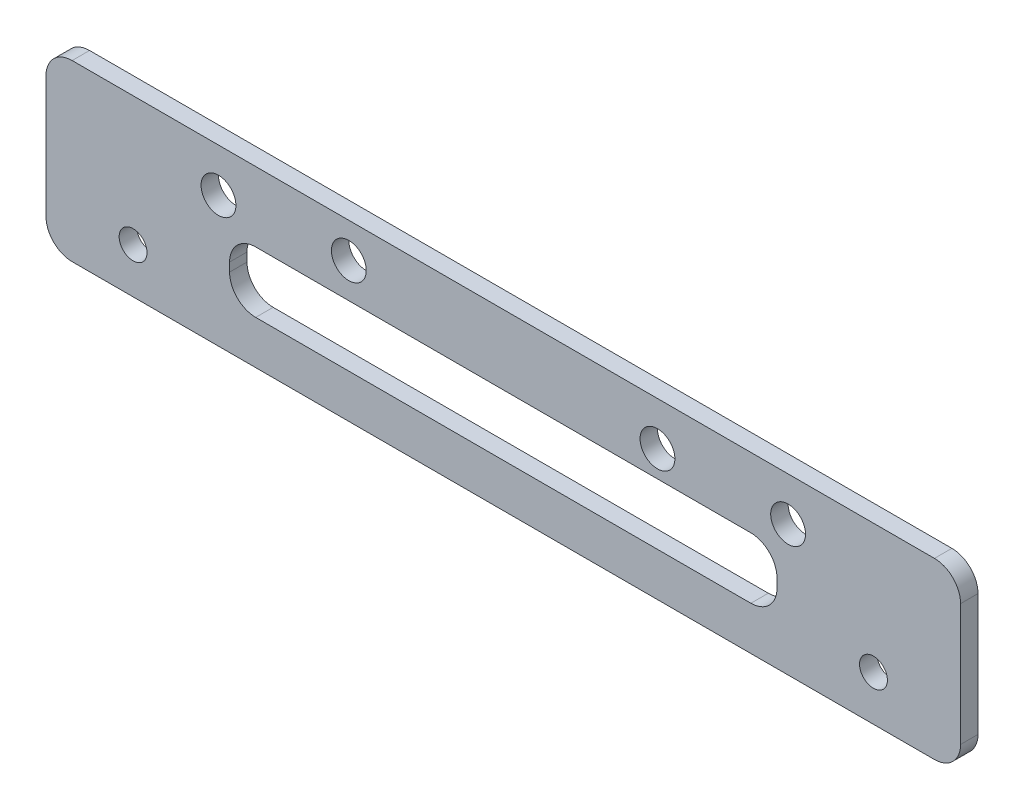
ISO-10303-21;
HEADER;
FILE_DESCRIPTION(('STEP AP214'),'2;1');
FILE_NAME('part.step','',(''),(''),'','','');
FILE_SCHEMA(('AUTOMOTIVE_DESIGN { 1 0 10303 214 1 1 1 1 }'));
ENDSEC;
DATA;
#1=APPLICATION_CONTEXT('core data for automotive mechanical design processes');
#2=APPLICATION_PROTOCOL_DEFINITION('international standard','automotive_design',2000,#1);
#3=PRODUCT_CONTEXT('',#1,'mechanical');
#4=PRODUCT('Part','Part','',(#3));
#5=PRODUCT_RELATED_PRODUCT_CATEGORY('part','',(#4));
#6=PRODUCT_DEFINITION_FORMATION('','',#4);
#7=PRODUCT_DEFINITION_CONTEXT('part definition',#1,'design');
#8=PRODUCT_DEFINITION('design','',#6,#7);
#9=PRODUCT_DEFINITION_SHAPE('','',#8);
#10=(LENGTH_UNIT() NAMED_UNIT(*) SI_UNIT(.MILLI.,.METRE.));
#11=(NAMED_UNIT(*) PLANE_ANGLE_UNIT() SI_UNIT($,.RADIAN.));
#12=(NAMED_UNIT(*) SI_UNIT($,.STERADIAN.) SOLID_ANGLE_UNIT());
#13=UNCERTAINTY_MEASURE_WITH_UNIT(LENGTH_MEASURE(1.E-05),#10,'distance_accuracy_value','');
#14=(GEOMETRIC_REPRESENTATION_CONTEXT(3) GLOBAL_UNCERTAINTY_ASSIGNED_CONTEXT((#13)) GLOBAL_UNIT_ASSIGNED_CONTEXT((#10,
#11,#12)) REPRESENTATION_CONTEXT('',''));
#15=CARTESIAN_POINT('',(0.,0.,0.));
#16=DIRECTION('',(0.,0.,1.));
#17=DIRECTION('',(1.,0.,0.));
#18=AXIS2_PLACEMENT_3D('',#15,#16,#17);
#19=CARTESIAN_POINT('',(52.5,10.,2.));
#20=DIRECTION('',(-1.,0.,0.));
#21=DIRECTION('',(0.,0.,1.));
#22=AXIS2_PLACEMENT_3D('',#19,#20,#21);
#23=PLANE('',#22);
#24=DIRECTION('',(0.,1.,0.));
#25=VECTOR('',#24,1.);
#26=CARTESIAN_POINT('',(52.5,10.,2.));
#27=LINE('',#26,#25);
#28=CARTESIAN_POINT('',(52.5,-7.,2.));
#29=VERTEX_POINT('',#28);
#30=CARTESIAN_POINT('',(52.5,7.,2.));
#31=VERTEX_POINT('',#30);
#32=EDGE_CURVE('E201',#29,#31,#27,.T.);
#33=ORIENTED_EDGE('',*,*,#32,.F.);
#34=DIRECTION('',(0.,0.,-1.));
#35=VECTOR('',#34,1.);
#36=CARTESIAN_POINT('',(52.5,-7.,2.));
#37=LINE('',#36,#35);
#38=CARTESIAN_POINT('',(52.5,-7.,0.));
#39=VERTEX_POINT('',#38);
#40=EDGE_CURVE('E227',#29,#39,#37,.T.);
#41=ORIENTED_EDGE('',*,*,#40,.T.);
#42=DIRECTION('',(0.,1.,0.));
#43=VECTOR('',#42,1.);
#44=CARTESIAN_POINT('',(52.5,10.,0.));
#45=LINE('',#44,#43);
#46=CARTESIAN_POINT('',(52.5,7.,0.));
#47=VERTEX_POINT('',#46);
#48=EDGE_CURVE('E215',#39,#47,#45,.T.);
#49=ORIENTED_EDGE('',*,*,#48,.T.);
#50=DIRECTION('',(0.,0.,-1.));
#51=VECTOR('',#50,1.);
#52=CARTESIAN_POINT('',(52.5,7.,2.));
#53=LINE('',#52,#51);
#54=EDGE_CURVE('E214',#47,#31,#53,.F.);
#55=ORIENTED_EDGE('',*,*,#54,.T.);
#56=EDGE_LOOP('',(#33,#41,#49,#55));
#57=FACE_BOUND('',#56,.T.);
#58=ADVANCED_FACE('F41',(#57),#23,.F.);
#59=CARTESIAN_POINT('',(-52.5,10.,2.));
#60=DIRECTION('',(0.,-1.,0.));
#61=DIRECTION('',(0.,0.,-1.));
#62=AXIS2_PLACEMENT_3D('',#59,#60,#61);
#63=PLANE('',#62);
#64=DIRECTION('',(-1.,0.,0.));
#65=VECTOR('',#64,1.);
#66=CARTESIAN_POINT('',(-52.5,10.,2.));
#67=LINE('',#66,#65);
#68=CARTESIAN_POINT('',(49.5,10.,2.));
#69=VERTEX_POINT('',#68);
#70=CARTESIAN_POINT('',(-49.5,10.,2.));
#71=VERTEX_POINT('',#70);
#72=EDGE_CURVE('E204',#69,#71,#67,.T.);
#73=ORIENTED_EDGE('',*,*,#72,.F.);
#74=DIRECTION('',(0.,0.,-1.));
#75=VECTOR('',#74,1.);
#76=CARTESIAN_POINT('',(49.5,10.,2.));
#77=LINE('',#76,#75);
#78=CARTESIAN_POINT('',(49.5,10.,0.));
#79=VERTEX_POINT('',#78);
#80=EDGE_CURVE('E253',#69,#79,#77,.T.);
#81=ORIENTED_EDGE('',*,*,#80,.T.);
#82=DIRECTION('',(-1.,0.,0.));
#83=VECTOR('',#82,1.);
#84=CARTESIAN_POINT('',(-52.5,10.,0.));
#85=LINE('',#84,#83);
#86=CARTESIAN_POINT('',(-49.5,10.,0.));
#87=VERTEX_POINT('',#86);
#88=EDGE_CURVE('E218',#79,#87,#85,.T.);
#89=ORIENTED_EDGE('',*,*,#88,.T.);
#90=DIRECTION('',(0.,0.,-1.));
#91=VECTOR('',#90,1.);
#92=CARTESIAN_POINT('',(-49.5,10.,2.));
#93=LINE('',#92,#91);
#94=EDGE_CURVE('E251',#87,#71,#93,.F.);
#95=ORIENTED_EDGE('',*,*,#94,.T.);
#96=EDGE_LOOP('',(#73,#81,#89,#95));
#97=FACE_BOUND('',#96,.T.);
#98=ADVANCED_FACE('F312',(#97),#63,.F.);
#99=CARTESIAN_POINT('',(-52.5,10.,2.));
#100=DIRECTION('',(1.,0.,0.));
#101=DIRECTION('',(0.,0.,-1.));
#102=AXIS2_PLACEMENT_3D('',#99,#100,#101);
#103=PLANE('',#102);
#104=DIRECTION('',(0.,-1.,0.));
#105=VECTOR('',#104,1.);
#106=CARTESIAN_POINT('',(-52.5,10.,0.));
#107=LINE('',#106,#105);
#108=CARTESIAN_POINT('',(-52.5,7.,0.));
#109=VERTEX_POINT('',#108);
#110=CARTESIAN_POINT('',(-52.5,-7.,0.));
#111=VERTEX_POINT('',#110);
#112=EDGE_CURVE('E221',#109,#111,#107,.T.);
#113=ORIENTED_EDGE('',*,*,#112,.T.);
#114=DIRECTION('',(0.,0.,-1.));
#115=VECTOR('',#114,1.);
#116=CARTESIAN_POINT('',(-52.5,-7.,2.));
#117=LINE('',#116,#115);
#118=CARTESIAN_POINT('',(-52.5,-7.,2.));
#119=VERTEX_POINT('',#118);
#120=EDGE_CURVE('E259',#111,#119,#117,.F.);
#121=ORIENTED_EDGE('',*,*,#120,.T.);
#122=DIRECTION('',(0.,-1.,0.));
#123=VECTOR('',#122,1.);
#124=CARTESIAN_POINT('',(-52.5,10.,2.));
#125=LINE('',#124,#123);
#126=CARTESIAN_POINT('',(-52.5,7.,2.));
#127=VERTEX_POINT('',#126);
#128=EDGE_CURVE('E208',#127,#119,#125,.T.);
#129=ORIENTED_EDGE('',*,*,#128,.F.);
#130=DIRECTION('',(0.,0.,-1.));
#131=VECTOR('',#130,1.);
#132=CARTESIAN_POINT('',(-52.5,7.,2.));
#133=LINE('',#132,#131);
#134=EDGE_CURVE('E256',#127,#109,#133,.T.);
#135=ORIENTED_EDGE('',*,*,#134,.T.);
#136=EDGE_LOOP('',(#113,#121,#129,#135));
#137=FACE_BOUND('',#136,.T.);
#138=ADVANCED_FACE('F318',(#137),#103,.F.);
#139=CARTESIAN_POINT('',(-52.5,-10.,2.));
#140=DIRECTION('',(0.,1.,0.));
#141=DIRECTION('',(0.,0.,1.));
#142=AXIS2_PLACEMENT_3D('',#139,#140,#141);
#143=PLANE('',#142);
#144=DIRECTION('',(1.,0.,0.));
#145=VECTOR('',#144,1.);
#146=CARTESIAN_POINT('',(-52.5,-10.,0.));
#147=LINE('',#146,#145);
#148=CARTESIAN_POINT('',(-49.5,-10.,0.));
#149=VERTEX_POINT('',#148);
#150=CARTESIAN_POINT('',(49.5,-10.,0.));
#151=VERTEX_POINT('',#150);
#152=EDGE_CURVE('E205',#149,#151,#147,.T.);
#153=ORIENTED_EDGE('',*,*,#152,.T.);
#154=DIRECTION('',(0.,0.,-1.));
#155=VECTOR('',#154,1.);
#156=CARTESIAN_POINT('',(49.5,-10.,2.));
#157=LINE('',#156,#155);
#158=CARTESIAN_POINT('',(49.5,-10.,2.));
#159=VERTEX_POINT('',#158);
#160=EDGE_CURVE('E241',#151,#159,#157,.F.);
#161=ORIENTED_EDGE('',*,*,#160,.T.);
#162=DIRECTION('',(1.,0.,0.));
#163=VECTOR('',#162,1.);
#164=CARTESIAN_POINT('',(-52.5,-10.,2.));
#165=LINE('',#164,#163);
#166=CARTESIAN_POINT('',(-49.5,-10.,2.));
#167=VERTEX_POINT('',#166);
#168=EDGE_CURVE('E211',#167,#159,#165,.T.);
#169=ORIENTED_EDGE('',*,*,#168,.F.);
#170=DIRECTION('',(0.,0.,-1.));
#171=VECTOR('',#170,1.);
#172=CARTESIAN_POINT('',(-49.5,-10.,2.));
#173=LINE('',#172,#171);
#174=EDGE_CURVE('E238',#167,#149,#173,.T.);
#175=ORIENTED_EDGE('',*,*,#174,.T.);
#176=EDGE_LOOP('',(#153,#161,#169,#175));
#177=FACE_BOUND('',#176,.T.);
#178=ADVANCED_FACE('F347',(#177),#143,.F.);
#179=CARTESIAN_POINT('',(0.,0.,2.));
#180=DIRECTION('',(0.,0.,1.));
#181=DIRECTION('',(1.,0.,0.));
#182=AXIS2_PLACEMENT_3D('',#179,#180,#181);
#183=PLANE('',#182);
#184=CARTESIAN_POINT('',(-42.5,-4.8157435507221,2.));
#185=DIRECTION('',(0.,0.,1.));
#186=DIRECTION('',(1.,0.,0.));
#187=AXIS2_PLACEMENT_3D('',#184,#185,#186);
#188=CIRCLE('',#187,1.6);
#189=CARTESIAN_POINT('',(-40.9,-4.8157435507221,2.));
#190=VERTEX_POINT('',#189);
#191=EDGE_CURVE('E180',#190,#190,#188,.T.);
#192=ORIENTED_EDGE('',*,*,#191,.F.);
#193=EDGE_LOOP('',(#192));
#194=FACE_BOUND('',#193,.T.);
#195=CARTESIAN_POINT('',(32.7,5.,2.));
#196=DIRECTION('',(0.,0.,1.));
#197=DIRECTION('',(1.,0.,0.));
#198=AXIS2_PLACEMENT_3D('',#195,#196,#197);
#199=CIRCLE('',#198,2.);
#200=CARTESIAN_POINT('',(34.7,5.,2.));
#201=VERTEX_POINT('',#200);
#202=EDGE_CURVE('E186',#201,#201,#199,.T.);
#203=ORIENTED_EDGE('',*,*,#202,.F.);
#204=EDGE_LOOP('',(#203));
#205=FACE_BOUND('',#204,.T.);
#206=CARTESIAN_POINT('',(17.7,5.,2.));
#207=DIRECTION('',(0.,0.,1.));
#208=DIRECTION('',(1.,0.,0.));
#209=AXIS2_PLACEMENT_3D('',#206,#207,#208);
#210=CIRCLE('',#209,2.);
#211=CARTESIAN_POINT('',(19.7,5.,2.));
#212=VERTEX_POINT('',#211);
#213=EDGE_CURVE('E189',#212,#212,#210,.T.);
#214=ORIENTED_EDGE('',*,*,#213,.F.);
#215=EDGE_LOOP('',(#214));
#216=FACE_BOUND('',#215,.T.);
#217=CARTESIAN_POINT('',(-17.7332226321509,5.99778515785661,2.));
#218=DIRECTION('',(0.,0.,1.));
#219=DIRECTION('',(1.,0.,0.));
#220=AXIS2_PLACEMENT_3D('',#217,#218,#219);
#221=CIRCLE('',#220,2.);
#222=CARTESIAN_POINT('',(-15.7332226321509,5.99778515785661,2.));
#223=VERTEX_POINT('',#222);
#224=EDGE_CURVE('E192',#223,#223,#221,.T.);
#225=ORIENTED_EDGE('',*,*,#224,.F.);
#226=EDGE_LOOP('',(#225));
#227=FACE_BOUND('',#226,.T.);
#228=CARTESIAN_POINT('',(42.5,-4.8157435507221,2.));
#229=DIRECTION('',(0.,0.,1.));
#230=DIRECTION('',(1.,0.,0.));
#231=AXIS2_PLACEMENT_3D('',#228,#229,#230);
#232=CIRCLE('',#231,1.6);
#233=CARTESIAN_POINT('',(44.1,-4.8157435507221,2.));
#234=VERTEX_POINT('',#233);
#235=EDGE_CURVE('E177',#234,#234,#232,.T.);
#236=ORIENTED_EDGE('',*,*,#235,.F.);
#237=EDGE_LOOP('',(#236));
#238=FACE_BOUND('',#237,.T.);
#239=CARTESIAN_POINT('',(28.4234761144441,-2.,2.));
#240=DIRECTION('',(0.,0.,1.));
#241=DIRECTION('',(-1.,0.,0.));
#242=AXIS2_PLACEMENT_3D('',#239,#240,#241);
#243=CIRCLE('',#242,3.);
#244=CARTESIAN_POINT('',(28.4234761144441,-5.,2.));
#245=VERTEX_POINT('',#244);
#246=CARTESIAN_POINT('',(31.4234761144441,-2.,2.));
#247=VERTEX_POINT('',#246);
#248=EDGE_CURVE('E58',#245,#247,#243,.T.);
#249=ORIENTED_EDGE('',*,*,#248,.F.);
#250=DIRECTION('',(1.,0.,0.));
#251=VECTOR('',#250,1.);
#252=CARTESIAN_POINT('',(-28.4234761144441,-5.,2.));
#253=LINE('',#252,#251);
#254=CARTESIAN_POINT('',(-28.4234761144441,-5.,2.));
#255=VERTEX_POINT('',#254);
#256=EDGE_CURVE('E163',#255,#245,#253,.T.);
#257=ORIENTED_EDGE('',*,*,#256,.F.);
#258=CARTESIAN_POINT('',(-28.4234761144441,-2.,2.));
#259=DIRECTION('',(0.,0.,1.));
#260=DIRECTION('',(-1.,0.,0.));
#261=AXIS2_PLACEMENT_3D('',#258,#259,#260);
#262=CIRCLE('',#261,3.);
#263=CARTESIAN_POINT('',(-31.4234761144441,-2.,2.));
#264=VERTEX_POINT('',#263);
#265=EDGE_CURVE('E169',#264,#255,#262,.T.);
#266=ORIENTED_EDGE('',*,*,#265,.F.);
#267=DIRECTION('',(0.,-1.,0.));
#268=VECTOR('',#267,1.);
#269=CARTESIAN_POINT('',(-31.4234761144441,-1.,2.));
#270=LINE('',#269,#268);
#271=CARTESIAN_POINT('',(-31.4234761144441,-1.,2.));
#272=VERTEX_POINT('',#271);
#273=EDGE_CURVE('E616',#272,#264,#270,.T.);
#274=ORIENTED_EDGE('',*,*,#273,.F.);
#275=CARTESIAN_POINT('',(-28.4234761144441,-1.,2.));
#276=DIRECTION('',(0.,0.,1.));
#277=DIRECTION('',(1.,0.,0.));
#278=AXIS2_PLACEMENT_3D('',#275,#276,#277);
#279=CIRCLE('',#278,3.);
#280=CARTESIAN_POINT('',(-28.4234761144441,2.,2.));
#281=VERTEX_POINT('',#280);
#282=EDGE_CURVE('E619',#281,#272,#279,.T.);
#283=ORIENTED_EDGE('',*,*,#282,.F.);
#284=DIRECTION('',(-1.,0.,0.));
#285=VECTOR('',#284,1.);
#286=CARTESIAN_POINT('',(-28.4234761144441,2.,2.));
#287=LINE('',#286,#285);
#288=CARTESIAN_POINT('',(28.4234761144441,2.,2.));
#289=VERTEX_POINT('',#288);
#290=EDGE_CURVE('E622',#289,#281,#287,.T.);
#291=ORIENTED_EDGE('',*,*,#290,.F.);
#292=CARTESIAN_POINT('',(28.4234761144441,-1.,2.));
#293=DIRECTION('',(0.,0.,1.));
#294=DIRECTION('',(1.,0.,0.));
#295=AXIS2_PLACEMENT_3D('',#292,#293,#294);
#296=CIRCLE('',#295,3.);
#297=CARTESIAN_POINT('',(31.4234761144441,-1.,2.));
#298=VERTEX_POINT('',#297);
#299=EDGE_CURVE('E182',#298,#289,#296,.T.);
#300=ORIENTED_EDGE('',*,*,#299,.F.);
#301=DIRECTION('',(0.,1.,0.));
#302=VECTOR('',#301,1.);
#303=CARTESIAN_POINT('',(31.4234761144441,-1.,2.));
#304=LINE('',#303,#302);
#305=EDGE_CURVE('E176',#247,#298,#304,.T.);
#306=ORIENTED_EDGE('',*,*,#305,.F.);
#307=EDGE_LOOP('',(#249,#257,#266,#274,#283,#291,#300,#306));
#308=FACE_BOUND('',#307,.T.);
#309=CARTESIAN_POINT('',(-32.7,5.,2.));
#310=DIRECTION('',(0.,0.,1.));
#311=DIRECTION('',(1.,0.,0.));
#312=AXIS2_PLACEMENT_3D('',#309,#310,#311);
#313=CIRCLE('',#312,2.);
#314=CARTESIAN_POINT('',(-30.7,5.,2.));
#315=VERTEX_POINT('',#314);
#316=EDGE_CURVE('E195',#315,#315,#313,.T.);
#317=ORIENTED_EDGE('',*,*,#316,.F.);
#318=EDGE_LOOP('',(#317));
#319=FACE_BOUND('',#318,.T.);
#320=ORIENTED_EDGE('',*,*,#168,.T.);
#321=CARTESIAN_POINT('',(49.5,-7.,2.));
#322=DIRECTION('',(0.,0.,1.));
#323=DIRECTION('',(1.,0.,0.));
#324=AXIS2_PLACEMENT_3D('',#321,#322,#323);
#325=CIRCLE('',#324,3.);
#326=EDGE_CURVE('E249',#159,#29,#325,.T.);
#327=ORIENTED_EDGE('',*,*,#326,.T.);
#328=ORIENTED_EDGE('',*,*,#32,.T.);
#329=CARTESIAN_POINT('',(49.5,7.,2.));
#330=DIRECTION('',(0.,0.,1.));
#331=DIRECTION('',(1.,0.,0.));
#332=AXIS2_PLACEMENT_3D('',#329,#330,#331);
#333=CIRCLE('',#332,3.);
#334=EDGE_CURVE('E247',#31,#69,#333,.T.);
#335=ORIENTED_EDGE('',*,*,#334,.T.);
#336=ORIENTED_EDGE('',*,*,#72,.T.);
#337=CARTESIAN_POINT('',(-49.5,7.,2.));
#338=DIRECTION('',(0.,0.,1.));
#339=DIRECTION('',(1.,0.,0.));
#340=AXIS2_PLACEMENT_3D('',#337,#338,#339);
#341=CIRCLE('',#340,3.);
#342=EDGE_CURVE('E243',#71,#127,#341,.T.);
#343=ORIENTED_EDGE('',*,*,#342,.T.);
#344=ORIENTED_EDGE('',*,*,#128,.T.);
#345=CARTESIAN_POINT('',(-49.5,-7.,2.));
#346=DIRECTION('',(0.,0.,1.));
#347=DIRECTION('',(1.,0.,0.));
#348=AXIS2_PLACEMENT_3D('',#345,#346,#347);
#349=CIRCLE('',#348,3.);
#350=EDGE_CURVE('E245',#119,#167,#349,.T.);
#351=ORIENTED_EDGE('',*,*,#350,.T.);
#352=EDGE_LOOP('',(#320,#327,#328,#335,#336,#343,#344,#351));
#353=FACE_BOUND('',#352,.T.);
#354=ADVANCED_FACE('F173',(#194,#205,#216,#227,#238,#308,#319,#353),#183,.T.);
#355=CARTESIAN_POINT('',(0.,0.,0.));
#356=DIRECTION('',(0.,0.,1.));
#357=DIRECTION('',(1.,0.,0.));
#358=AXIS2_PLACEMENT_3D('',#355,#356,#357);
#359=PLANE('',#358);
#360=CARTESIAN_POINT('',(-42.5,-4.8157435507221,0.));
#361=DIRECTION('',(0.,0.,1.));
#362=DIRECTION('',(1.,0.,0.));
#363=AXIS2_PLACEMENT_3D('',#360,#361,#362);
#364=CIRCLE('',#363,1.6);
#365=CARTESIAN_POINT('',(-40.9,-4.8157435507221,0.));
#366=VERTEX_POINT('',#365);
#367=EDGE_CURVE('E45',#366,#366,#364,.T.);
#368=ORIENTED_EDGE('',*,*,#367,.T.);
#369=EDGE_LOOP('',(#368));
#370=FACE_BOUND('',#369,.T.);
#371=CARTESIAN_POINT('',(32.7,5.,0.));
#372=DIRECTION('',(0.,0.,1.));
#373=DIRECTION('',(1.,0.,0.));
#374=AXIS2_PLACEMENT_3D('',#371,#372,#373);
#375=CIRCLE('',#374,2.);
#376=CARTESIAN_POINT('',(34.7,5.,0.));
#377=VERTEX_POINT('',#376);
#378=EDGE_CURVE('E290',#377,#377,#375,.T.);
#379=ORIENTED_EDGE('',*,*,#378,.T.);
#380=EDGE_LOOP('',(#379));
#381=FACE_BOUND('',#380,.T.);
#382=CARTESIAN_POINT('',(17.7,5.,0.));
#383=DIRECTION('',(0.,0.,1.));
#384=DIRECTION('',(1.,0.,0.));
#385=AXIS2_PLACEMENT_3D('',#382,#383,#384);
#386=CIRCLE('',#385,2.);
#387=CARTESIAN_POINT('',(19.7,5.,0.));
#388=VERTEX_POINT('',#387);
#389=EDGE_CURVE('E288',#388,#388,#386,.T.);
#390=ORIENTED_EDGE('',*,*,#389,.T.);
#391=EDGE_LOOP('',(#390));
#392=FACE_BOUND('',#391,.T.);
#393=CARTESIAN_POINT('',(-17.7332226321509,5.99778515785661,0.));
#394=DIRECTION('',(0.,0.,1.));
#395=DIRECTION('',(1.,0.,0.));
#396=AXIS2_PLACEMENT_3D('',#393,#394,#395);
#397=CIRCLE('',#396,2.);
#398=CARTESIAN_POINT('',(-15.7332226321509,5.99778515785661,0.));
#399=VERTEX_POINT('',#398);
#400=EDGE_CURVE('E285',#399,#399,#397,.T.);
#401=ORIENTED_EDGE('',*,*,#400,.T.);
#402=EDGE_LOOP('',(#401));
#403=FACE_BOUND('',#402,.T.);
#404=CARTESIAN_POINT('',(42.5,-4.8157435507221,0.));
#405=DIRECTION('',(0.,0.,1.));
#406=DIRECTION('',(1.,0.,0.));
#407=AXIS2_PLACEMENT_3D('',#404,#405,#406);
#408=CIRCLE('',#407,1.6);
#409=CARTESIAN_POINT('',(44.1,-4.8157435507221,0.));
#410=VERTEX_POINT('',#409);
#411=EDGE_CURVE('E264',#410,#410,#408,.T.);
#412=ORIENTED_EDGE('',*,*,#411,.T.);
#413=EDGE_LOOP('',(#412));
#414=FACE_BOUND('',#413,.T.);
#415=DIRECTION('',(1.,0.,0.));
#416=VECTOR('',#415,1.);
#417=CARTESIAN_POINT('',(0.,-5.,0.));
#418=LINE('',#417,#416);
#419=CARTESIAN_POINT('',(-28.4234761144441,-5.,0.));
#420=VERTEX_POINT('',#419);
#421=CARTESIAN_POINT('',(28.4234761144441,-5.,0.));
#422=VERTEX_POINT('',#421);
#423=EDGE_CURVE('E50',#420,#422,#418,.T.);
#424=ORIENTED_EDGE('',*,*,#423,.T.);
#425=CARTESIAN_POINT('',(28.4234761144441,-2.,0.));
#426=DIRECTION('',(0.,0.,1.));
#427=DIRECTION('',(1.,0.,0.));
#428=AXIS2_PLACEMENT_3D('',#425,#426,#427);
#429=CIRCLE('',#428,3.);
#430=CARTESIAN_POINT('',(31.4234761144441,-2.,0.));
#431=VERTEX_POINT('',#430);
#432=EDGE_CURVE('E11',#422,#431,#429,.T.);
#433=ORIENTED_EDGE('',*,*,#432,.T.);
#434=DIRECTION('',(0.,1.,0.));
#435=VECTOR('',#434,1.);
#436=CARTESIAN_POINT('',(31.4234761144441,0.,0.));
#437=LINE('',#436,#435);
#438=CARTESIAN_POINT('',(31.4234761144441,-1.,0.));
#439=VERTEX_POINT('',#438);
#440=EDGE_CURVE('E261',#431,#439,#437,.T.);
#441=ORIENTED_EDGE('',*,*,#440,.T.);
#442=CARTESIAN_POINT('',(28.4234761144441,-1.,0.));
#443=DIRECTION('',(0.,0.,1.));
#444=DIRECTION('',(1.,0.,0.));
#445=AXIS2_PLACEMENT_3D('',#442,#443,#444);
#446=CIRCLE('',#445,3.);
#447=CARTESIAN_POINT('',(28.4234761144441,2.,0.));
#448=VERTEX_POINT('',#447);
#449=EDGE_CURVE('E267',#439,#448,#446,.T.);
#450=ORIENTED_EDGE('',*,*,#449,.T.);
#451=DIRECTION('',(-1.,0.,0.));
#452=VECTOR('',#451,1.);
#453=CARTESIAN_POINT('',(0.,2.,0.));
#454=LINE('',#453,#452);
#455=CARTESIAN_POINT('',(-28.4234761144441,2.,0.));
#456=VERTEX_POINT('',#455);
#457=EDGE_CURVE('E270',#448,#456,#454,.T.);
#458=ORIENTED_EDGE('',*,*,#457,.T.);
#459=CARTESIAN_POINT('',(-28.4234761144441,-1.,0.));
#460=DIRECTION('',(0.,0.,1.));
#461=DIRECTION('',(1.,0.,0.));
#462=AXIS2_PLACEMENT_3D('',#459,#460,#461);
#463=CIRCLE('',#462,3.);
#464=CARTESIAN_POINT('',(-31.4234761144441,-1.,0.));
#465=VERTEX_POINT('',#464);
#466=EDGE_CURVE('E273',#456,#465,#463,.T.);
#467=ORIENTED_EDGE('',*,*,#466,.T.);
#468=DIRECTION('',(0.,-1.,0.));
#469=VECTOR('',#468,1.);
#470=CARTESIAN_POINT('',(-31.4234761144441,0.,0.));
#471=LINE('',#470,#469);
#472=CARTESIAN_POINT('',(-31.4234761144441,-2.,0.));
#473=VERTEX_POINT('',#472);
#474=EDGE_CURVE('E276',#465,#473,#471,.T.);
#475=ORIENTED_EDGE('',*,*,#474,.T.);
#476=CARTESIAN_POINT('',(-28.4234761144441,-2.,0.));
#477=DIRECTION('',(0.,0.,1.));
#478=DIRECTION('',(1.,0.,0.));
#479=AXIS2_PLACEMENT_3D('',#476,#477,#478);
#480=CIRCLE('',#479,3.);
#481=EDGE_CURVE('E279',#473,#420,#480,.T.);
#482=ORIENTED_EDGE('',*,*,#481,.T.);
#483=EDGE_LOOP('',(#424,#433,#441,#450,#458,#467,#475,#482));
#484=FACE_BOUND('',#483,.T.);
#485=CARTESIAN_POINT('',(-32.7,5.,0.));
#486=DIRECTION('',(0.,0.,1.));
#487=DIRECTION('',(1.,0.,0.));
#488=AXIS2_PLACEMENT_3D('',#485,#486,#487);
#489=CIRCLE('',#488,2.);
#490=CARTESIAN_POINT('',(-30.7,5.,0.));
#491=VERTEX_POINT('',#490);
#492=EDGE_CURVE('E200',#491,#491,#489,.T.);
#493=ORIENTED_EDGE('',*,*,#492,.T.);
#494=EDGE_LOOP('',(#493));
#495=FACE_BOUND('',#494,.T.);
#496=ORIENTED_EDGE('',*,*,#48,.F.);
#497=CARTESIAN_POINT('',(49.5,-7.,0.));
#498=DIRECTION('',(0.,0.,1.));
#499=DIRECTION('',(1.,0.,0.));
#500=AXIS2_PLACEMENT_3D('',#497,#498,#499);
#501=CIRCLE('',#500,3.);
#502=EDGE_CURVE('E236',#39,#151,#501,.F.);
#503=ORIENTED_EDGE('',*,*,#502,.T.);
#504=ORIENTED_EDGE('',*,*,#152,.F.);
#505=CARTESIAN_POINT('',(-49.5,-7.,0.));
#506=DIRECTION('',(0.,0.,1.));
#507=DIRECTION('',(1.,0.,0.));
#508=AXIS2_PLACEMENT_3D('',#505,#506,#507);
#509=CIRCLE('',#508,3.);
#510=EDGE_CURVE('E232',#149,#111,#509,.F.);
#511=ORIENTED_EDGE('',*,*,#510,.T.);
#512=ORIENTED_EDGE('',*,*,#112,.F.);
#513=CARTESIAN_POINT('',(-49.5,7.,0.));
#514=DIRECTION('',(0.,0.,1.));
#515=DIRECTION('',(1.,0.,0.));
#516=AXIS2_PLACEMENT_3D('',#513,#514,#515);
#517=CIRCLE('',#516,3.);
#518=EDGE_CURVE('E230',#109,#87,#517,.F.);
#519=ORIENTED_EDGE('',*,*,#518,.T.);
#520=ORIENTED_EDGE('',*,*,#88,.F.);
#521=CARTESIAN_POINT('',(49.5,7.,0.));
#522=DIRECTION('',(0.,0.,1.));
#523=DIRECTION('',(1.,0.,0.));
#524=AXIS2_PLACEMENT_3D('',#521,#522,#523);
#525=CIRCLE('',#524,3.);
#526=EDGE_CURVE('E234',#79,#47,#525,.F.);
#527=ORIENTED_EDGE('',*,*,#526,.T.);
#528=EDGE_LOOP('',(#496,#503,#504,#511,#512,#519,#520,#527));
#529=FACE_BOUND('',#528,.T.);
#530=ADVANCED_FACE('F297',(#370,#381,#392,#403,#414,#484,#495,#529),#359,.F.);
#531=CARTESIAN_POINT('',(49.5,-7.,2.));
#532=DIRECTION('',(0.,0.,-1.));
#533=DIRECTION('',(-1.,0.,0.));
#534=AXIS2_PLACEMENT_3D('',#531,#532,#533);
#535=CYLINDRICAL_SURFACE('',#534,3.);
#536=ORIENTED_EDGE('',*,*,#326,.F.);
#537=ORIENTED_EDGE('',*,*,#160,.F.);
#538=ORIENTED_EDGE('',*,*,#502,.F.);
#539=ORIENTED_EDGE('',*,*,#40,.F.);
#540=EDGE_LOOP('',(#536,#537,#538,#539));
#541=FACE_BOUND('',#540,.T.);
#542=ADVANCED_FACE('F324',(#541),#535,.T.);
#543=CARTESIAN_POINT('',(49.5,7.,2.));
#544=DIRECTION('',(0.,0.,-1.));
#545=DIRECTION('',(-1.,0.,0.));
#546=AXIS2_PLACEMENT_3D('',#543,#544,#545);
#547=CYLINDRICAL_SURFACE('',#546,3.);
#548=ORIENTED_EDGE('',*,*,#334,.F.);
#549=ORIENTED_EDGE('',*,*,#54,.F.);
#550=ORIENTED_EDGE('',*,*,#526,.F.);
#551=ORIENTED_EDGE('',*,*,#80,.F.);
#552=EDGE_LOOP('',(#548,#549,#550,#551));
#553=FACE_BOUND('',#552,.T.);
#554=ADVANCED_FACE('F327',(#553),#547,.T.);
#555=CARTESIAN_POINT('',(-49.5,-7.,2.));
#556=DIRECTION('',(0.,0.,-1.));
#557=DIRECTION('',(-1.,0.,0.));
#558=AXIS2_PLACEMENT_3D('',#555,#556,#557);
#559=CYLINDRICAL_SURFACE('',#558,3.);
#560=ORIENTED_EDGE('',*,*,#350,.F.);
#561=ORIENTED_EDGE('',*,*,#120,.F.);
#562=ORIENTED_EDGE('',*,*,#510,.F.);
#563=ORIENTED_EDGE('',*,*,#174,.F.);
#564=EDGE_LOOP('',(#560,#561,#562,#563));
#565=FACE_BOUND('',#564,.T.);
#566=ADVANCED_FACE('F330',(#565),#559,.T.);
#567=CARTESIAN_POINT('',(-49.5,7.,2.));
#568=DIRECTION('',(0.,0.,-1.));
#569=DIRECTION('',(-1.,0.,0.));
#570=AXIS2_PLACEMENT_3D('',#567,#568,#569);
#571=CYLINDRICAL_SURFACE('',#570,3.);
#572=ORIENTED_EDGE('',*,*,#342,.F.);
#573=ORIENTED_EDGE('',*,*,#94,.F.);
#574=ORIENTED_EDGE('',*,*,#518,.F.);
#575=ORIENTED_EDGE('',*,*,#134,.F.);
#576=EDGE_LOOP('',(#572,#573,#574,#575));
#577=FACE_BOUND('',#576,.T.);
#578=ADVANCED_FACE('F43',(#577),#571,.T.);
#579=CARTESIAN_POINT('',(-32.7,5.,-1.));
#580=DIRECTION('',(0.,0.,1.));
#581=DIRECTION('',(1.,0.,0.));
#582=AXIS2_PLACEMENT_3D('',#579,#580,#581);
#583=CYLINDRICAL_SURFACE('',#582,2.);
#584=ORIENTED_EDGE('',*,*,#316,.T.);
#585=EDGE_LOOP('',(#584));
#586=FACE_BOUND('',#585,.T.);
#587=ORIENTED_EDGE('',*,*,#492,.F.);
#588=EDGE_LOOP('',(#587));
#589=FACE_BOUND('',#588,.T.);
#590=ADVANCED_FACE('F337',(#586,#589),#583,.F.);
#591=CARTESIAN_POINT('',(28.4234761144441,-2.,-1.));
#592=DIRECTION('',(0.,0.,1.));
#593=DIRECTION('',(1.,0.,0.));
#594=AXIS2_PLACEMENT_3D('',#591,#592,#593);
#595=CYLINDRICAL_SURFACE('',#594,3.);
#596=DIRECTION('',(0.,0.,1.));
#597=VECTOR('',#596,1.);
#598=CARTESIAN_POINT('',(28.4234761144441,-5.,-1.));
#599=LINE('',#598,#597);
#600=EDGE_CURVE('E155',#422,#245,#599,.T.);
#601=ORIENTED_EDGE('',*,*,#600,.T.);
#602=ORIENTED_EDGE('',*,*,#248,.T.);
#603=DIRECTION('',(0.,0.,1.));
#604=VECTOR('',#603,1.);
#605=CARTESIAN_POINT('',(31.4234761144441,-2.,-1.));
#606=LINE('',#605,#604);
#607=EDGE_CURVE('E170',#431,#247,#606,.T.);
#608=ORIENTED_EDGE('',*,*,#607,.F.);
#609=ORIENTED_EDGE('',*,*,#432,.F.);
#610=EDGE_LOOP('',(#601,#602,#608,#609));
#611=FACE_BOUND('',#610,.T.);
#612=ADVANCED_FACE('F157',(#611),#595,.F.);
#613=CARTESIAN_POINT('',(-28.4234761144441,-5.,-1.));
#614=DIRECTION('',(0.,-1.,0.));
#615=DIRECTION('',(1.,0.,0.));
#616=AXIS2_PLACEMENT_3D('',#613,#614,#615);
#617=PLANE('',#616);
#618=DIRECTION('',(0.,0.,1.));
#619=VECTOR('',#618,1.);
#620=CARTESIAN_POINT('',(-28.4234761144441,-5.,-1.));
#621=LINE('',#620,#619);
#622=EDGE_CURVE('E160',#420,#255,#621,.T.);
#623=ORIENTED_EDGE('',*,*,#622,.T.);
#624=ORIENTED_EDGE('',*,*,#256,.T.);
#625=ORIENTED_EDGE('',*,*,#600,.F.);
#626=ORIENTED_EDGE('',*,*,#423,.F.);
#627=EDGE_LOOP('',(#623,#624,#625,#626));
#628=FACE_BOUND('',#627,.T.);
#629=ADVANCED_FACE('F164',(#628),#617,.F.);
#630=CARTESIAN_POINT('',(-28.4234761144441,-2.,-1.));
#631=DIRECTION('',(0.,0.,1.));
#632=DIRECTION('',(1.,0.,0.));
#633=AXIS2_PLACEMENT_3D('',#630,#631,#632);
#634=CYLINDRICAL_SURFACE('',#633,3.);
#635=DIRECTION('',(0.,0.,1.));
#636=VECTOR('',#635,1.);
#637=CARTESIAN_POINT('',(-31.4234761144441,-2.,-1.));
#638=LINE('',#637,#636);
#639=EDGE_CURVE('E609',#473,#264,#638,.T.);
#640=ORIENTED_EDGE('',*,*,#639,.T.);
#641=ORIENTED_EDGE('',*,*,#265,.T.);
#642=ORIENTED_EDGE('',*,*,#622,.F.);
#643=ORIENTED_EDGE('',*,*,#481,.F.);
#644=EDGE_LOOP('',(#640,#641,#642,#643));
#645=FACE_BOUND('',#644,.T.);
#646=ADVANCED_FACE('F424',(#645),#634,.F.);
#647=CARTESIAN_POINT('',(-31.4234761144441,-1.,-1.));
#648=DIRECTION('',(-1.,0.,0.));
#649=DIRECTION('',(0.,0.,1.));
#650=AXIS2_PLACEMENT_3D('',#647,#648,#649);
#651=PLANE('',#650);
#652=DIRECTION('',(0.,0.,1.));
#653=VECTOR('',#652,1.);
#654=CARTESIAN_POINT('',(-31.4234761144441,-1.,-1.));
#655=LINE('',#654,#653);
#656=EDGE_CURVE('E611',#465,#272,#655,.T.);
#657=ORIENTED_EDGE('',*,*,#656,.T.);
#658=ORIENTED_EDGE('',*,*,#273,.T.);
#659=ORIENTED_EDGE('',*,*,#639,.F.);
#660=ORIENTED_EDGE('',*,*,#474,.F.);
#661=EDGE_LOOP('',(#657,#658,#659,#660));
#662=FACE_BOUND('',#661,.T.);
#663=ADVANCED_FACE('F434',(#662),#651,.F.);
#664=CARTESIAN_POINT('',(-28.4234761144441,-1.,-1.));
#665=DIRECTION('',(0.,0.,1.));
#666=DIRECTION('',(1.,0.,0.));
#667=AXIS2_PLACEMENT_3D('',#664,#665,#666);
#668=CYLINDRICAL_SURFACE('',#667,3.);
#669=DIRECTION('',(0.,0.,1.));
#670=VECTOR('',#669,1.);
#671=CARTESIAN_POINT('',(-28.4234761144441,2.,-1.));
#672=LINE('',#671,#670);
#673=EDGE_CURVE('E631',#456,#281,#672,.T.);
#674=ORIENTED_EDGE('',*,*,#673,.T.);
#675=ORIENTED_EDGE('',*,*,#282,.T.);
#676=ORIENTED_EDGE('',*,*,#656,.F.);
#677=ORIENTED_EDGE('',*,*,#466,.F.);
#678=EDGE_LOOP('',(#674,#675,#676,#677));
#679=FACE_BOUND('',#678,.T.);
#680=ADVANCED_FACE('F445',(#679),#668,.F.);
#681=CARTESIAN_POINT('',(-28.4234761144441,2.,-1.));
#682=DIRECTION('',(0.,1.,0.));
#683=DIRECTION('',(0.,0.,1.));
#684=AXIS2_PLACEMENT_3D('',#681,#682,#683);
#685=PLANE('',#684);
#686=DIRECTION('',(0.,0.,1.));
#687=VECTOR('',#686,1.);
#688=CARTESIAN_POINT('',(28.4234761144441,2.,-1.));
#689=LINE('',#688,#687);
#690=EDGE_CURVE('E627',#448,#289,#689,.T.);
#691=ORIENTED_EDGE('',*,*,#690,.T.);
#692=ORIENTED_EDGE('',*,*,#290,.T.);
#693=ORIENTED_EDGE('',*,*,#673,.F.);
#694=ORIENTED_EDGE('',*,*,#457,.F.);
#695=EDGE_LOOP('',(#691,#692,#693,#694));
#696=FACE_BOUND('',#695,.T.);
#697=ADVANCED_FACE('F456',(#696),#685,.F.);
#698=CARTESIAN_POINT('',(28.4234761144441,-1.,-1.));
#699=DIRECTION('',(0.,0.,1.));
#700=DIRECTION('',(1.,0.,0.));
#701=AXIS2_PLACEMENT_3D('',#698,#699,#700);
#702=CYLINDRICAL_SURFACE('',#701,3.);
#703=DIRECTION('',(0.,0.,1.));
#704=VECTOR('',#703,1.);
#705=CARTESIAN_POINT('',(31.4234761144441,-1.,-1.));
#706=LINE('',#705,#704);
#707=EDGE_CURVE('E66',#439,#298,#706,.T.);
#708=ORIENTED_EDGE('',*,*,#707,.T.);
#709=ORIENTED_EDGE('',*,*,#299,.T.);
#710=ORIENTED_EDGE('',*,*,#690,.F.);
#711=ORIENTED_EDGE('',*,*,#449,.F.);
#712=EDGE_LOOP('',(#708,#709,#710,#711));
#713=FACE_BOUND('',#712,.T.);
#714=ADVANCED_FACE('F467',(#713),#702,.F.);
#715=CARTESIAN_POINT('',(31.4234761144441,-1.,-1.));
#716=DIRECTION('',(1.,0.,0.));
#717=DIRECTION('',(0.,0.,-1.));
#718=AXIS2_PLACEMENT_3D('',#715,#716,#717);
#719=PLANE('',#718);
#720=ORIENTED_EDGE('',*,*,#607,.T.);
#721=ORIENTED_EDGE('',*,*,#305,.T.);
#722=ORIENTED_EDGE('',*,*,#707,.F.);
#723=ORIENTED_EDGE('',*,*,#440,.F.);
#724=EDGE_LOOP('',(#720,#721,#722,#723));
#725=FACE_BOUND('',#724,.T.);
#726=ADVANCED_FACE('F478',(#725),#719,.F.);
#727=CARTESIAN_POINT('',(42.5,-4.8157435507221,-1.));
#728=DIRECTION('',(0.,0.,1.));
#729=DIRECTION('',(1.,0.,0.));
#730=AXIS2_PLACEMENT_3D('',#727,#728,#729);
#731=CYLINDRICAL_SURFACE('',#730,1.6);
#732=ORIENTED_EDGE('',*,*,#235,.T.);
#733=EDGE_LOOP('',(#732));
#734=FACE_BOUND('',#733,.T.);
#735=ORIENTED_EDGE('',*,*,#411,.F.);
#736=EDGE_LOOP('',(#735));
#737=FACE_BOUND('',#736,.T.);
#738=ADVANCED_FACE('F489',(#734,#737),#731,.F.);
#739=CARTESIAN_POINT('',(-17.7332226321509,5.99778515785661,-1.));
#740=DIRECTION('',(0.,0.,1.));
#741=DIRECTION('',(1.,0.,0.));
#742=AXIS2_PLACEMENT_3D('',#739,#740,#741);
#743=CYLINDRICAL_SURFACE('',#742,2.);
#744=ORIENTED_EDGE('',*,*,#224,.T.);
#745=EDGE_LOOP('',(#744));
#746=FACE_BOUND('',#745,.T.);
#747=ORIENTED_EDGE('',*,*,#400,.F.);
#748=EDGE_LOOP('',(#747));
#749=FACE_BOUND('',#748,.T.);
#750=ADVANCED_FACE('F499',(#746,#749),#743,.F.);
#751=CARTESIAN_POINT('',(17.7,5.,-1.));
#752=DIRECTION('',(0.,0.,1.));
#753=DIRECTION('',(1.,0.,0.));
#754=AXIS2_PLACEMENT_3D('',#751,#752,#753);
#755=CYLINDRICAL_SURFACE('',#754,2.);
#756=ORIENTED_EDGE('',*,*,#213,.T.);
#757=EDGE_LOOP('',(#756));
#758=FACE_BOUND('',#757,.T.);
#759=ORIENTED_EDGE('',*,*,#389,.F.);
#760=EDGE_LOOP('',(#759));
#761=FACE_BOUND('',#760,.T.);
#762=ADVANCED_FACE('F307',(#758,#761),#755,.F.);
#763=CARTESIAN_POINT('',(32.7,5.,-1.));
#764=DIRECTION('',(0.,0.,1.));
#765=DIRECTION('',(1.,0.,0.));
#766=AXIS2_PLACEMENT_3D('',#763,#764,#765);
#767=CYLINDRICAL_SURFACE('',#766,2.);
#768=ORIENTED_EDGE('',*,*,#202,.T.);
#769=EDGE_LOOP('',(#768));
#770=FACE_BOUND('',#769,.T.);
#771=ORIENTED_EDGE('',*,*,#378,.F.);
#772=EDGE_LOOP('',(#771));
#773=FACE_BOUND('',#772,.T.);
#774=ADVANCED_FACE('F301',(#770,#773),#767,.F.);
#775=CARTESIAN_POINT('',(-42.5,-4.8157435507221,-1.));
#776=DIRECTION('',(0.,0.,1.));
#777=DIRECTION('',(1.,0.,0.));
#778=AXIS2_PLACEMENT_3D('',#775,#776,#777);
#779=CYLINDRICAL_SURFACE('',#778,1.6);
#780=ORIENTED_EDGE('',*,*,#191,.T.);
#781=EDGE_LOOP('',(#780));
#782=FACE_BOUND('',#781,.T.);
#783=ORIENTED_EDGE('',*,*,#367,.F.);
#784=EDGE_LOOP('',(#783));
#785=FACE_BOUND('',#784,.T.);
#786=ADVANCED_FACE('F299',(#782,#785),#779,.F.);
#787=CLOSED_SHELL('',(#58,#98,#138,#178,#354,#530,#542,#554,#566,#578,#590,#612,#629,#646,#663,
#680,#697,#714,#726,#738,#750,#762,#774,#786));
#788=MANIFOLD_SOLID_BREP('B2',#787);
#789=ADVANCED_BREP_SHAPE_REPRESENTATION('',(#18,#788),#14);
#790=SHAPE_DEFINITION_REPRESENTATION(#9,#789);
ENDSEC;
END-ISO-10303-21;
